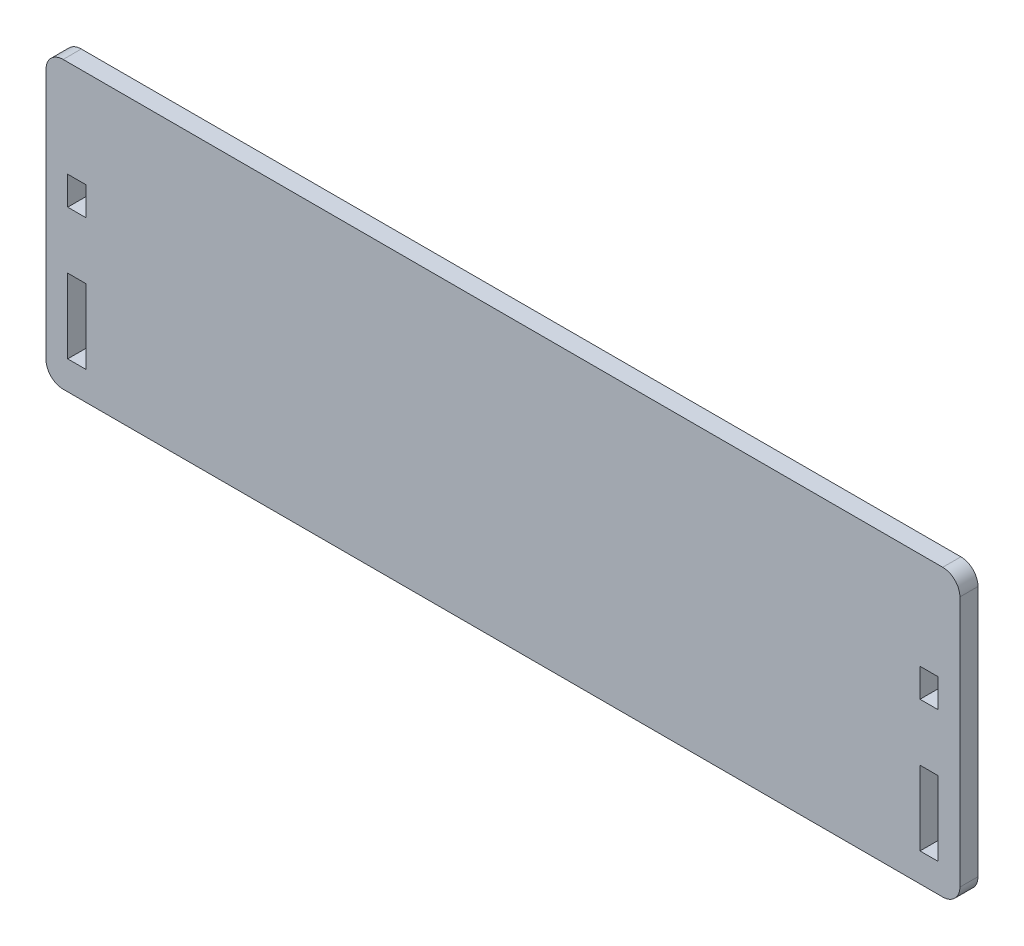
ISO-10303-21;
HEADER;
FILE_DESCRIPTION(('STEP AP214'),'2;1');
FILE_NAME('part.step','',(''),(''),'','','');
FILE_SCHEMA(('AUTOMOTIVE_DESIGN { 1 0 10303 214 1 1 1 1 }'));
ENDSEC;
DATA;
#1=APPLICATION_CONTEXT('core data for automotive mechanical design processes');
#2=APPLICATION_PROTOCOL_DEFINITION('international standard','automotive_design',2000,#1);
#3=PRODUCT_CONTEXT('',#1,'mechanical');
#4=PRODUCT('Part','Part','',(#3));
#5=PRODUCT_RELATED_PRODUCT_CATEGORY('part','',(#4));
#6=PRODUCT_DEFINITION_FORMATION('','',#4);
#7=PRODUCT_DEFINITION_CONTEXT('part definition',#1,'design');
#8=PRODUCT_DEFINITION('design','',#6,#7);
#9=PRODUCT_DEFINITION_SHAPE('','',#8);
#10=(LENGTH_UNIT() NAMED_UNIT(*) SI_UNIT(.MILLI.,.METRE.));
#11=(NAMED_UNIT(*) PLANE_ANGLE_UNIT() SI_UNIT($,.RADIAN.));
#12=(NAMED_UNIT(*) SI_UNIT($,.STERADIAN.) SOLID_ANGLE_UNIT());
#13=UNCERTAINTY_MEASURE_WITH_UNIT(LENGTH_MEASURE(1.E-05),#10,'distance_accuracy_value','');
#14=(GEOMETRIC_REPRESENTATION_CONTEXT(3) GLOBAL_UNCERTAINTY_ASSIGNED_CONTEXT((#13)) GLOBAL_UNIT_ASSIGNED_CONTEXT((#10,
#11,#12)) REPRESENTATION_CONTEXT('',''));
#15=CARTESIAN_POINT('',(0.,0.,0.));
#16=DIRECTION('',(0.,0.,1.));
#17=DIRECTION('',(1.,0.,0.));
#18=AXIS2_PLACEMENT_3D('',#15,#16,#17);
#19=CARTESIAN_POINT('',(-73.025,0.,3.175));
#20=DIRECTION('',(1.,0.,0.));
#21=DIRECTION('',(0.,0.,-1.));
#22=AXIS2_PLACEMENT_3D('',#19,#20,#21);
#23=PLANE('',#22);
#24=DIRECTION('',(0.,-1.,0.));
#25=VECTOR('',#24,1.);
#26=CARTESIAN_POINT('',(-73.025,0.,0.));
#27=LINE('',#26,#25);
#28=CARTESIAN_POINT('',(-73.025,-7.,0.));
#29=VERTEX_POINT('',#28);
#30=CARTESIAN_POINT('',(-73.025,-20.,0.));
#31=VERTEX_POINT('',#30);
#32=EDGE_CURVE('E314',#29,#31,#27,.T.);
#33=ORIENTED_EDGE('',*,*,#32,.T.);
#34=DIRECTION('',(0.,0.,-1.));
#35=VECTOR('',#34,1.);
#36=CARTESIAN_POINT('',(-73.025,-20.,3.175));
#37=LINE('',#36,#35);
#38=CARTESIAN_POINT('',(-73.025,-20.,3.175));
#39=VERTEX_POINT('',#38);
#40=EDGE_CURVE('E332',#39,#31,#37,.T.);
#41=ORIENTED_EDGE('',*,*,#40,.F.);
#42=DIRECTION('',(0.,-1.,0.));
#43=VECTOR('',#42,1.);
#44=CARTESIAN_POINT('',(-73.025,0.,3.175));
#45=LINE('',#44,#43);
#46=CARTESIAN_POINT('',(-73.025,-7.,3.175));
#47=VERTEX_POINT('',#46);
#48=EDGE_CURVE('E260',#47,#39,#45,.T.);
#49=ORIENTED_EDGE('',*,*,#48,.F.);
#50=DIRECTION('',(0.,0.,-1.));
#51=VECTOR('',#50,1.);
#52=CARTESIAN_POINT('',(-73.025,-7.,3.175));
#53=LINE('',#52,#51);
#54=EDGE_CURVE('E322',#47,#29,#53,.T.);
#55=ORIENTED_EDGE('',*,*,#54,.T.);
#56=EDGE_LOOP('',(#33,#41,#49,#55));
#57=FACE_BOUND('',#56,.T.);
#58=ADVANCED_FACE('F36',(#57),#23,.F.);
#59=CARTESIAN_POINT('',(0.,-20.,3.175));
#60=DIRECTION('',(0.,-1.,0.));
#61=DIRECTION('',(0.,0.,-1.));
#62=AXIS2_PLACEMENT_3D('',#59,#60,#61);
#63=PLANE('',#62);
#64=DIRECTION('',(-1.,0.,0.));
#65=VECTOR('',#64,1.);
#66=CARTESIAN_POINT('',(0.,-20.,0.));
#67=LINE('',#66,#65);
#68=CARTESIAN_POINT('',(-76.2,-20.,0.));
#69=VERTEX_POINT('',#68);
#70=EDGE_CURVE('E317',#31,#69,#67,.T.);
#71=ORIENTED_EDGE('',*,*,#70,.T.);
#72=DIRECTION('',(0.,0.,-1.));
#73=VECTOR('',#72,1.);
#74=CARTESIAN_POINT('',(-76.2,-20.,3.175));
#75=LINE('',#74,#73);
#76=CARTESIAN_POINT('',(-76.2,-20.,3.175));
#77=VERTEX_POINT('',#76);
#78=EDGE_CURVE('E329',#77,#69,#75,.T.);
#79=ORIENTED_EDGE('',*,*,#78,.F.);
#80=DIRECTION('',(-1.,0.,0.));
#81=VECTOR('',#80,1.);
#82=CARTESIAN_POINT('',(0.,-20.,3.175));
#83=LINE('',#82,#81);
#84=EDGE_CURVE('E263',#39,#77,#83,.T.);
#85=ORIENTED_EDGE('',*,*,#84,.F.);
#86=ORIENTED_EDGE('',*,*,#40,.T.);
#87=EDGE_LOOP('',(#71,#79,#85,#86));
#88=FACE_BOUND('',#87,.T.);
#89=ADVANCED_FACE('F424',(#88),#63,.F.);
#90=CARTESIAN_POINT('',(-76.2,0.,3.175));
#91=DIRECTION('',(-1.,0.,0.));
#92=DIRECTION('',(0.,0.,1.));
#93=AXIS2_PLACEMENT_3D('',#90,#91,#92);
#94=PLANE('',#93);
#95=DIRECTION('',(0.,1.,0.));
#96=VECTOR('',#95,1.);
#97=CARTESIAN_POINT('',(-76.2,0.,0.));
#98=LINE('',#97,#96);
#99=CARTESIAN_POINT('',(-76.2,-7.,0.));
#100=VERTEX_POINT('',#99);
#101=EDGE_CURVE('E319',#69,#100,#98,.T.);
#102=ORIENTED_EDGE('',*,*,#101,.T.);
#103=DIRECTION('',(0.,0.,-1.));
#104=VECTOR('',#103,1.);
#105=CARTESIAN_POINT('',(-76.2,-7.,3.175));
#106=LINE('',#105,#104);
#107=CARTESIAN_POINT('',(-76.2,-7.,3.175));
#108=VERTEX_POINT('',#107);
#109=EDGE_CURVE('E325',#108,#100,#106,.T.);
#110=ORIENTED_EDGE('',*,*,#109,.F.);
#111=DIRECTION('',(0.,1.,0.));
#112=VECTOR('',#111,1.);
#113=CARTESIAN_POINT('',(-76.2,0.,3.175));
#114=LINE('',#113,#112);
#115=EDGE_CURVE('E265',#77,#108,#114,.T.);
#116=ORIENTED_EDGE('',*,*,#115,.F.);
#117=ORIENTED_EDGE('',*,*,#78,.T.);
#118=EDGE_LOOP('',(#102,#110,#116,#117));
#119=FACE_BOUND('',#118,.T.);
#120=ADVANCED_FACE('F430',(#119),#94,.F.);
#121=CARTESIAN_POINT('',(-73.025,0.,3.175));
#122=DIRECTION('',(1.,0.,0.));
#123=DIRECTION('',(0.,0.,-1.));
#124=AXIS2_PLACEMENT_3D('',#121,#122,#123);
#125=PLANE('',#124);
#126=DIRECTION('',(0.,-1.,0.));
#127=VECTOR('',#126,1.);
#128=CARTESIAN_POINT('',(-73.025,0.,0.));
#129=LINE('',#128,#127);
#130=CARTESIAN_POINT('',(-73.025,8.,0.));
#131=VERTEX_POINT('',#130);
#132=CARTESIAN_POINT('',(-73.025,3.,0.));
#133=VERTEX_POINT('',#132);
#134=EDGE_CURVE('E303',#131,#133,#129,.T.);
#135=ORIENTED_EDGE('',*,*,#134,.T.);
#136=DIRECTION('',(0.,0.,-1.));
#137=VECTOR('',#136,1.);
#138=CARTESIAN_POINT('',(-73.025,3.,3.175));
#139=LINE('',#138,#137);
#140=CARTESIAN_POINT('',(-73.025,3.,3.175));
#141=VERTEX_POINT('',#140);
#142=EDGE_CURVE('E326',#141,#133,#139,.T.);
#143=ORIENTED_EDGE('',*,*,#142,.F.);
#144=DIRECTION('',(0.,-1.,0.));
#145=VECTOR('',#144,1.);
#146=CARTESIAN_POINT('',(-73.025,0.,3.175));
#147=LINE('',#146,#145);
#148=CARTESIAN_POINT('',(-73.025,8.,3.175));
#149=VERTEX_POINT('',#148);
#150=EDGE_CURVE('E250',#149,#141,#147,.T.);
#151=ORIENTED_EDGE('',*,*,#150,.F.);
#152=DIRECTION('',(0.,0.,-1.));
#153=VECTOR('',#152,1.);
#154=CARTESIAN_POINT('',(-73.025,8.,3.175));
#155=LINE('',#154,#153);
#156=EDGE_CURVE('E336',#149,#131,#155,.T.);
#157=ORIENTED_EDGE('',*,*,#156,.T.);
#158=EDGE_LOOP('',(#135,#143,#151,#157));
#159=FACE_BOUND('',#158,.T.);
#160=ADVANCED_FACE('F447',(#159),#125,.F.);
#161=CARTESIAN_POINT('',(0.,3.,3.175));
#162=DIRECTION('',(0.,-1.,0.));
#163=DIRECTION('',(0.,0.,-1.));
#164=AXIS2_PLACEMENT_3D('',#161,#162,#163);
#165=PLANE('',#164);
#166=DIRECTION('',(-1.,0.,0.));
#167=VECTOR('',#166,1.);
#168=CARTESIAN_POINT('',(0.,3.,0.));
#169=LINE('',#168,#167);
#170=CARTESIAN_POINT('',(-76.2,3.,0.));
#171=VERTEX_POINT('',#170);
#172=EDGE_CURVE('E306',#133,#171,#169,.T.);
#173=ORIENTED_EDGE('',*,*,#172,.T.);
#174=DIRECTION('',(0.,0.,-1.));
#175=VECTOR('',#174,1.);
#176=CARTESIAN_POINT('',(-76.2,3.,3.175));
#177=LINE('',#176,#175);
#178=CARTESIAN_POINT('',(-76.2,3.,3.175));
#179=VERTEX_POINT('',#178);
#180=EDGE_CURVE('E342',#179,#171,#177,.T.);
#181=ORIENTED_EDGE('',*,*,#180,.F.);
#182=DIRECTION('',(-1.,0.,0.));
#183=VECTOR('',#182,1.);
#184=CARTESIAN_POINT('',(0.,3.,3.175));
#185=LINE('',#184,#183);
#186=EDGE_CURVE('E253',#141,#179,#185,.T.);
#187=ORIENTED_EDGE('',*,*,#186,.F.);
#188=ORIENTED_EDGE('',*,*,#142,.T.);
#189=EDGE_LOOP('',(#173,#181,#187,#188));
#190=FACE_BOUND('',#189,.T.);
#191=ADVANCED_FACE('F443',(#190),#165,.F.);
#192=CARTESIAN_POINT('',(-76.2,0.,3.175));
#193=DIRECTION('',(1.,0.,0.));
#194=DIRECTION('',(0.,0.,-1.));
#195=AXIS2_PLACEMENT_3D('',#192,#193,#194);
#196=PLANE('',#195);
#197=DIRECTION('',(0.,-1.,0.));
#198=VECTOR('',#197,1.);
#199=CARTESIAN_POINT('',(-76.2,0.,0.));
#200=LINE('',#199,#198);
#201=CARTESIAN_POINT('',(-76.2,8.,0.));
#202=VERTEX_POINT('',#201);
#203=EDGE_CURVE('E309',#202,#171,#200,.T.);
#204=ORIENTED_EDGE('',*,*,#203,.F.);
#205=DIRECTION('',(0.,0.,-1.));
#206=VECTOR('',#205,1.);
#207=CARTESIAN_POINT('',(-76.2,8.,3.175));
#208=LINE('',#207,#206);
#209=CARTESIAN_POINT('',(-76.2,8.,3.175));
#210=VERTEX_POINT('',#209);
#211=EDGE_CURVE('E339',#210,#202,#208,.T.);
#212=ORIENTED_EDGE('',*,*,#211,.F.);
#213=DIRECTION('',(0.,-1.,0.));
#214=VECTOR('',#213,1.);
#215=CARTESIAN_POINT('',(-76.2,0.,3.175));
#216=LINE('',#215,#214);
#217=EDGE_CURVE('E255',#210,#179,#216,.T.);
#218=ORIENTED_EDGE('',*,*,#217,.T.);
#219=ORIENTED_EDGE('',*,*,#180,.T.);
#220=EDGE_LOOP('',(#204,#212,#218,#219));
#221=FACE_BOUND('',#220,.T.);
#222=ADVANCED_FACE('F440',(#221),#196,.T.);
#223=CARTESIAN_POINT('',(80.,0.,3.175));
#224=DIRECTION('',(1.,0.,0.));
#225=DIRECTION('',(0.,0.,-1.));
#226=AXIS2_PLACEMENT_3D('',#223,#224,#225);
#227=PLANE('',#226);
#228=DIRECTION('',(0.,-1.,0.));
#229=VECTOR('',#228,1.);
#230=CARTESIAN_POINT('',(80.,0.,3.175));
#231=LINE('',#230,#229);
#232=CARTESIAN_POINT('',(80.,22.,3.175));
#233=VERTEX_POINT('',#232);
#234=CARTESIAN_POINT('',(80.,-22.,3.175));
#235=VERTEX_POINT('',#234);
#236=EDGE_CURVE('E240',#233,#235,#231,.T.);
#237=ORIENTED_EDGE('',*,*,#236,.T.);
#238=DIRECTION('',(0.,0.,-1.));
#239=VECTOR('',#238,1.);
#240=CARTESIAN_POINT('',(80.,-22.,0.));
#241=LINE('',#240,#239);
#242=CARTESIAN_POINT('',(80.,-22.,0.));
#243=VERTEX_POINT('',#242);
#244=EDGE_CURVE('E44',#235,#243,#241,.T.);
#245=ORIENTED_EDGE('',*,*,#244,.T.);
#246=DIRECTION('',(0.,-1.,0.));
#247=VECTOR('',#246,1.);
#248=CARTESIAN_POINT('',(80.,0.,0.));
#249=LINE('',#248,#247);
#250=CARTESIAN_POINT('',(80.,22.,0.));
#251=VERTEX_POINT('',#250);
#252=EDGE_CURVE('E291',#251,#243,#249,.T.);
#253=ORIENTED_EDGE('',*,*,#252,.F.);
#254=DIRECTION('',(0.,0.,-1.));
#255=VECTOR('',#254,1.);
#256=CARTESIAN_POINT('',(80.,22.,3.175));
#257=LINE('',#256,#255);
#258=EDGE_CURVE('E58',#251,#233,#257,.F.);
#259=ORIENTED_EDGE('',*,*,#258,.T.);
#260=EDGE_LOOP('',(#237,#245,#253,#259));
#261=FACE_BOUND('',#260,.T.);
#262=ADVANCED_FACE('F384',(#261),#227,.T.);
#263=CARTESIAN_POINT('',(0.,25.,3.175));
#264=DIRECTION('',(0.,1.,0.));
#265=DIRECTION('',(0.,0.,1.));
#266=AXIS2_PLACEMENT_3D('',#263,#264,#265);
#267=PLANE('',#266);
#268=DIRECTION('',(1.,0.,0.));
#269=VECTOR('',#268,1.);
#270=CARTESIAN_POINT('',(0.,25.,3.175));
#271=LINE('',#270,#269);
#272=CARTESIAN_POINT('',(-77.,25.,3.175));
#273=VERTEX_POINT('',#272);
#274=CARTESIAN_POINT('',(77.,25.,3.175));
#275=VERTEX_POINT('',#274);
#276=EDGE_CURVE('E242',#273,#275,#271,.T.);
#277=ORIENTED_EDGE('',*,*,#276,.T.);
#278=DIRECTION('',(0.,0.,-1.));
#279=VECTOR('',#278,1.);
#280=CARTESIAN_POINT('',(77.,25.,3.175));
#281=LINE('',#280,#279);
#282=CARTESIAN_POINT('',(77.,25.,0.));
#283=VERTEX_POINT('',#282);
#284=EDGE_CURVE('E11',#275,#283,#281,.T.);
#285=ORIENTED_EDGE('',*,*,#284,.T.);
#286=DIRECTION('',(1.,0.,0.));
#287=VECTOR('',#286,1.);
#288=CARTESIAN_POINT('',(0.,25.,0.));
#289=LINE('',#288,#287);
#290=CARTESIAN_POINT('',(-77.,25.,0.));
#291=VERTEX_POINT('',#290);
#292=EDGE_CURVE('E294',#291,#283,#289,.T.);
#293=ORIENTED_EDGE('',*,*,#292,.F.);
#294=DIRECTION('',(0.,0.,-1.));
#295=VECTOR('',#294,1.);
#296=CARTESIAN_POINT('',(-77.,25.,3.175));
#297=LINE('',#296,#295);
#298=EDGE_CURVE('E360',#291,#273,#297,.F.);
#299=ORIENTED_EDGE('',*,*,#298,.T.);
#300=EDGE_LOOP('',(#277,#285,#293,#299));
#301=FACE_BOUND('',#300,.T.);
#302=ADVANCED_FACE('F395',(#301),#267,.T.);
#303=CARTESIAN_POINT('',(-80.,0.,3.175));
#304=DIRECTION('',(1.,0.,0.));
#305=DIRECTION('',(0.,0.,-1.));
#306=AXIS2_PLACEMENT_3D('',#303,#304,#305);
#307=PLANE('',#306);
#308=DIRECTION('',(0.,-1.,0.));
#309=VECTOR('',#308,1.);
#310=CARTESIAN_POINT('',(-80.,0.,0.));
#311=LINE('',#310,#309);
#312=CARTESIAN_POINT('',(-80.,22.,0.));
#313=VERTEX_POINT('',#312);
#314=CARTESIAN_POINT('',(-80.,-22.,0.));
#315=VERTEX_POINT('',#314);
#316=EDGE_CURVE('E297',#313,#315,#311,.T.);
#317=ORIENTED_EDGE('',*,*,#316,.T.);
#318=DIRECTION('',(0.,0.,-1.));
#319=VECTOR('',#318,1.);
#320=CARTESIAN_POINT('',(-80.,-22.,3.175));
#321=LINE('',#320,#319);
#322=CARTESIAN_POINT('',(-80.,-22.,3.175));
#323=VERTEX_POINT('',#322);
#324=EDGE_CURVE('E375',#315,#323,#321,.F.);
#325=ORIENTED_EDGE('',*,*,#324,.T.);
#326=DIRECTION('',(0.,-1.,0.));
#327=VECTOR('',#326,1.);
#328=CARTESIAN_POINT('',(-80.,0.,3.175));
#329=LINE('',#328,#327);
#330=CARTESIAN_POINT('',(-80.,22.,3.175));
#331=VERTEX_POINT('',#330);
#332=EDGE_CURVE('E245',#331,#323,#329,.T.);
#333=ORIENTED_EDGE('',*,*,#332,.F.);
#334=DIRECTION('',(0.,0.,-1.));
#335=VECTOR('',#334,1.);
#336=CARTESIAN_POINT('',(-80.,22.,0.));
#337=LINE('',#336,#335);
#338=EDGE_CURVE('E335',#331,#313,#337,.T.);
#339=ORIENTED_EDGE('',*,*,#338,.T.);
#340=EDGE_LOOP('',(#317,#325,#333,#339));
#341=FACE_BOUND('',#340,.T.);
#342=ADVANCED_FACE('F406',(#341),#307,.F.);
#343=CARTESIAN_POINT('',(0.,-6.99999999999999,3.175));
#344=DIRECTION('',(0.,-1.,0.));
#345=DIRECTION('',(0.,0.,-1.));
#346=AXIS2_PLACEMENT_3D('',#343,#344,#345);
#347=PLANE('',#346);
#348=DIRECTION('',(-1.,0.,0.));
#349=VECTOR('',#348,1.);
#350=CARTESIAN_POINT('',(0.,-6.99999999999999,0.));
#351=LINE('',#350,#349);
#352=CARTESIAN_POINT('',(76.2,-6.99999999999999,0.));
#353=VERTEX_POINT('',#352);
#354=CARTESIAN_POINT('',(73.025,-6.99999999999999,0.));
#355=VERTEX_POINT('',#354);
#356=EDGE_CURVE('E279',#353,#355,#351,.T.);
#357=ORIENTED_EDGE('',*,*,#356,.F.);
#358=DIRECTION('',(0.,0.,-1.));
#359=VECTOR('',#358,1.);
#360=CARTESIAN_POINT('',(76.2,-6.99999999999999,3.175));
#361=LINE('',#360,#359);
#362=CARTESIAN_POINT('',(76.2,-6.99999999999999,3.175));
#363=VERTEX_POINT('',#362);
#364=EDGE_CURVE('E340',#363,#353,#361,.T.);
#365=ORIENTED_EDGE('',*,*,#364,.F.);
#366=DIRECTION('',(-1.,0.,0.));
#367=VECTOR('',#366,1.);
#368=CARTESIAN_POINT('',(0.,-6.99999999999999,3.175));
#369=LINE('',#368,#367);
#370=CARTESIAN_POINT('',(73.025,-6.99999999999999,3.175));
#371=VERTEX_POINT('',#370);
#372=EDGE_CURVE('E229',#363,#371,#369,.T.);
#373=ORIENTED_EDGE('',*,*,#372,.T.);
#374=DIRECTION('',(0.,0.,-1.));
#375=VECTOR('',#374,1.);
#376=CARTESIAN_POINT('',(73.025,-6.99999999999999,3.175));
#377=LINE('',#376,#375);
#378=EDGE_CURVE('E210',#371,#355,#377,.T.);
#379=ORIENTED_EDGE('',*,*,#378,.T.);
#380=EDGE_LOOP('',(#357,#365,#373,#379));
#381=FACE_BOUND('',#380,.T.);
#382=ADVANCED_FACE('F457',(#381),#347,.T.);
#383=CARTESIAN_POINT('',(76.2,0.,3.175));
#384=DIRECTION('',(1.,0.,0.));
#385=DIRECTION('',(0.,0.,-1.));
#386=AXIS2_PLACEMENT_3D('',#383,#384,#385);
#387=PLANE('',#386);
#388=DIRECTION('',(0.,-1.,0.));
#389=VECTOR('',#388,1.);
#390=CARTESIAN_POINT('',(76.2,0.,0.));
#391=LINE('',#390,#389);
#392=CARTESIAN_POINT('',(76.2,-20.,0.));
#393=VERTEX_POINT('',#392);
#394=EDGE_CURVE('E282',#353,#393,#391,.T.);
#395=ORIENTED_EDGE('',*,*,#394,.T.);
#396=DIRECTION('',(0.,0.,-1.));
#397=VECTOR('',#396,1.);
#398=CARTESIAN_POINT('',(76.2,-20.,3.175));
#399=LINE('',#398,#397);
#400=CARTESIAN_POINT('',(76.2,-20.,3.175));
#401=VERTEX_POINT('',#400);
#402=EDGE_CURVE('E349',#401,#393,#399,.T.);
#403=ORIENTED_EDGE('',*,*,#402,.F.);
#404=DIRECTION('',(0.,-1.,0.));
#405=VECTOR('',#404,1.);
#406=CARTESIAN_POINT('',(76.2,0.,3.175));
#407=LINE('',#406,#405);
#408=EDGE_CURVE('E232',#363,#401,#407,.T.);
#409=ORIENTED_EDGE('',*,*,#408,.F.);
#410=ORIENTED_EDGE('',*,*,#364,.T.);
#411=EDGE_LOOP('',(#395,#403,#409,#410));
#412=FACE_BOUND('',#411,.T.);
#413=ADVANCED_FACE('F469',(#412),#387,.F.);
#414=CARTESIAN_POINT('',(0.,-20.,3.175));
#415=DIRECTION('',(0.,1.,0.));
#416=DIRECTION('',(0.,0.,1.));
#417=AXIS2_PLACEMENT_3D('',#414,#415,#416);
#418=PLANE('',#417);
#419=DIRECTION('',(1.,0.,0.));
#420=VECTOR('',#419,1.);
#421=CARTESIAN_POINT('',(0.,-20.,0.));
#422=LINE('',#421,#420);
#423=CARTESIAN_POINT('',(73.025,-20.,0.));
#424=VERTEX_POINT('',#423);
#425=EDGE_CURVE('E285',#424,#393,#422,.T.);
#426=ORIENTED_EDGE('',*,*,#425,.F.);
#427=DIRECTION('',(0.,0.,-1.));
#428=VECTOR('',#427,1.);
#429=CARTESIAN_POINT('',(73.025,-20.,3.175));
#430=LINE('',#429,#428);
#431=CARTESIAN_POINT('',(73.025,-20.,3.175));
#432=VERTEX_POINT('',#431);
#433=EDGE_CURVE('E347',#432,#424,#430,.T.);
#434=ORIENTED_EDGE('',*,*,#433,.F.);
#435=DIRECTION('',(1.,0.,0.));
#436=VECTOR('',#435,1.);
#437=CARTESIAN_POINT('',(0.,-20.,3.175));
#438=LINE('',#437,#436);
#439=EDGE_CURVE('E234',#432,#401,#438,.T.);
#440=ORIENTED_EDGE('',*,*,#439,.T.);
#441=ORIENTED_EDGE('',*,*,#402,.T.);
#442=EDGE_LOOP('',(#426,#434,#440,#441));
#443=FACE_BOUND('',#442,.T.);
#444=ADVANCED_FACE('F466',(#443),#418,.T.);
#445=CARTESIAN_POINT('',(73.025,0.,3.175));
#446=DIRECTION('',(1.,0.,0.));
#447=DIRECTION('',(0.,0.,-1.));
#448=AXIS2_PLACEMENT_3D('',#445,#446,#447);
#449=PLANE('',#448);
#450=DIRECTION('',(0.,-1.,0.));
#451=VECTOR('',#450,1.);
#452=CARTESIAN_POINT('',(73.025,0.,0.));
#453=LINE('',#452,#451);
#454=CARTESIAN_POINT('',(73.025,8.,0.));
#455=VERTEX_POINT('',#454);
#456=CARTESIAN_POINT('',(73.025,3.,0.));
#457=VERTEX_POINT('',#456);
#458=EDGE_CURVE('E205',#455,#457,#453,.T.);
#459=ORIENTED_EDGE('',*,*,#458,.F.);
#460=DIRECTION('',(0.,0.,-1.));
#461=VECTOR('',#460,1.);
#462=CARTESIAN_POINT('',(73.025,8.,3.175));
#463=LINE('',#462,#461);
#464=CARTESIAN_POINT('',(73.025,8.,3.175));
#465=VERTEX_POINT('',#464);
#466=EDGE_CURVE('E199',#465,#455,#463,.T.);
#467=ORIENTED_EDGE('',*,*,#466,.F.);
#468=DIRECTION('',(0.,-1.,0.));
#469=VECTOR('',#468,1.);
#470=CARTESIAN_POINT('',(73.025,0.,3.175));
#471=LINE('',#470,#469);
#472=CARTESIAN_POINT('',(73.025,3.,3.175));
#473=VERTEX_POINT('',#472);
#474=EDGE_CURVE('E202',#465,#473,#471,.T.);
#475=ORIENTED_EDGE('',*,*,#474,.T.);
#476=DIRECTION('',(0.,0.,-1.));
#477=VECTOR('',#476,1.);
#478=CARTESIAN_POINT('',(73.025,3.,3.175));
#479=LINE('',#478,#477);
#480=EDGE_CURVE('E269',#473,#457,#479,.T.);
#481=ORIENTED_EDGE('',*,*,#480,.T.);
#482=EDGE_LOOP('',(#459,#467,#475,#481));
#483=FACE_BOUND('',#482,.T.);
#484=ADVANCED_FACE('F201',(#483),#449,.T.);
#485=CARTESIAN_POINT('',(0.,8.,3.175));
#486=DIRECTION('',(0.,-1.,0.));
#487=DIRECTION('',(0.,0.,-1.));
#488=AXIS2_PLACEMENT_3D('',#485,#486,#487);
#489=PLANE('',#488);
#490=DIRECTION('',(-1.,0.,0.));
#491=VECTOR('',#490,1.);
#492=CARTESIAN_POINT('',(0.,8.,0.));
#493=LINE('',#492,#491);
#494=CARTESIAN_POINT('',(76.2,8.,0.));
#495=VERTEX_POINT('',#494);
#496=EDGE_CURVE('E271',#495,#455,#493,.T.);
#497=ORIENTED_EDGE('',*,*,#496,.F.);
#498=DIRECTION('',(0.,0.,-1.));
#499=VECTOR('',#498,1.);
#500=CARTESIAN_POINT('',(76.2,8.,3.175));
#501=LINE('',#500,#499);
#502=CARTESIAN_POINT('',(76.2,8.,3.175));
#503=VERTEX_POINT('',#502);
#504=EDGE_CURVE('E211',#503,#495,#501,.T.);
#505=ORIENTED_EDGE('',*,*,#504,.F.);
#506=DIRECTION('',(-1.,0.,0.));
#507=VECTOR('',#506,1.);
#508=CARTESIAN_POINT('',(0.,8.,3.175));
#509=LINE('',#508,#507);
#510=EDGE_CURVE('E217',#503,#465,#509,.T.);
#511=ORIENTED_EDGE('',*,*,#510,.T.);
#512=ORIENTED_EDGE('',*,*,#466,.T.);
#513=EDGE_LOOP('',(#497,#505,#511,#512));
#514=FACE_BOUND('',#513,.T.);
#515=ADVANCED_FACE('F222',(#514),#489,.T.);
#516=CARTESIAN_POINT('',(76.2,0.,3.175));
#517=DIRECTION('',(1.,0.,0.));
#518=DIRECTION('',(0.,0.,-1.));
#519=AXIS2_PLACEMENT_3D('',#516,#517,#518);
#520=PLANE('',#519);
#521=DIRECTION('',(0.,-1.,0.));
#522=VECTOR('',#521,1.);
#523=CARTESIAN_POINT('',(76.2,0.,0.));
#524=LINE('',#523,#522);
#525=CARTESIAN_POINT('',(76.2,3.,0.));
#526=VERTEX_POINT('',#525);
#527=EDGE_CURVE('E273',#495,#526,#524,.T.);
#528=ORIENTED_EDGE('',*,*,#527,.T.);
#529=DIRECTION('',(0.,0.,-1.));
#530=VECTOR('',#529,1.);
#531=CARTESIAN_POINT('',(76.2,3.,3.175));
#532=LINE('',#531,#530);
#533=CARTESIAN_POINT('',(76.2,3.,3.175));
#534=VERTEX_POINT('',#533);
#535=EDGE_CURVE('E353',#534,#526,#532,.T.);
#536=ORIENTED_EDGE('',*,*,#535,.F.);
#537=DIRECTION('',(0.,-1.,0.));
#538=VECTOR('',#537,1.);
#539=CARTESIAN_POINT('',(76.2,0.,3.175));
#540=LINE('',#539,#538);
#541=EDGE_CURVE('E224',#503,#534,#540,.T.);
#542=ORIENTED_EDGE('',*,*,#541,.F.);
#543=ORIENTED_EDGE('',*,*,#504,.T.);
#544=EDGE_LOOP('',(#528,#536,#542,#543));
#545=FACE_BOUND('',#544,.T.);
#546=ADVANCED_FACE('F438',(#545),#520,.F.);
#547=CARTESIAN_POINT('',(0.,8.,3.175));
#548=DIRECTION('',(0.,1.,0.));
#549=DIRECTION('',(0.,0.,1.));
#550=AXIS2_PLACEMENT_3D('',#547,#548,#549);
#551=PLANE('',#550);
#552=DIRECTION('',(1.,0.,0.));
#553=VECTOR('',#552,1.);
#554=CARTESIAN_POINT('',(0.,8.,0.));
#555=LINE('',#554,#553);
#556=EDGE_CURVE('E312',#202,#131,#555,.T.);
#557=ORIENTED_EDGE('',*,*,#556,.T.);
#558=ORIENTED_EDGE('',*,*,#156,.F.);
#559=DIRECTION('',(1.,0.,0.));
#560=VECTOR('',#559,1.);
#561=CARTESIAN_POINT('',(0.,8.,3.175));
#562=LINE('',#561,#560);
#563=EDGE_CURVE('E258',#210,#149,#562,.T.);
#564=ORIENTED_EDGE('',*,*,#563,.F.);
#565=ORIENTED_EDGE('',*,*,#211,.T.);
#566=EDGE_LOOP('',(#557,#558,#564,#565));
#567=FACE_BOUND('',#566,.T.);
#568=ADVANCED_FACE('F435',(#567),#551,.F.);
#569=CARTESIAN_POINT('',(0.,-25.,3.175));
#570=DIRECTION('',(0.,1.,0.));
#571=DIRECTION('',(0.,0.,1.));
#572=AXIS2_PLACEMENT_3D('',#569,#570,#571);
#573=PLANE('',#572);
#574=DIRECTION('',(1.,0.,0.));
#575=VECTOR('',#574,1.);
#576=CARTESIAN_POINT('',(0.,-25.,3.175));
#577=LINE('',#576,#575);
#578=CARTESIAN_POINT('',(-77.,-25.,3.175));
#579=VERTEX_POINT('',#578);
#580=CARTESIAN_POINT('',(77.,-25.,3.175));
#581=VERTEX_POINT('',#580);
#582=EDGE_CURVE('E248',#579,#581,#577,.T.);
#583=ORIENTED_EDGE('',*,*,#582,.F.);
#584=DIRECTION('',(0.,0.,-1.));
#585=VECTOR('',#584,1.);
#586=CARTESIAN_POINT('',(-77.,-25.,3.175));
#587=LINE('',#586,#585);
#588=CARTESIAN_POINT('',(-77.,-25.,0.));
#589=VERTEX_POINT('',#588);
#590=EDGE_CURVE('E366',#579,#589,#587,.T.);
#591=ORIENTED_EDGE('',*,*,#590,.T.);
#592=DIRECTION('',(1.,0.,0.));
#593=VECTOR('',#592,1.);
#594=CARTESIAN_POINT('',(0.,-25.,0.));
#595=LINE('',#594,#593);
#596=CARTESIAN_POINT('',(77.,-25.,0.));
#597=VERTEX_POINT('',#596);
#598=EDGE_CURVE('E300',#589,#597,#595,.T.);
#599=ORIENTED_EDGE('',*,*,#598,.T.);
#600=DIRECTION('',(0.,0.,-1.));
#601=VECTOR('',#600,1.);
#602=CARTESIAN_POINT('',(77.,-25.,3.175));
#603=LINE('',#602,#601);
#604=EDGE_CURVE('E364',#597,#581,#603,.F.);
#605=ORIENTED_EDGE('',*,*,#604,.T.);
#606=EDGE_LOOP('',(#583,#591,#599,#605));
#607=FACE_BOUND('',#606,.T.);
#608=ADVANCED_FACE('F414',(#607),#573,.F.);
#609=CARTESIAN_POINT('',(73.025,0.,3.175));
#610=DIRECTION('',(1.,0.,0.));
#611=DIRECTION('',(0.,0.,-1.));
#612=AXIS2_PLACEMENT_3D('',#609,#610,#611);
#613=PLANE('',#612);
#614=DIRECTION('',(0.,-1.,0.));
#615=VECTOR('',#614,1.);
#616=CARTESIAN_POINT('',(73.025,0.,0.));
#617=LINE('',#616,#615);
#618=EDGE_CURVE('E288',#355,#424,#617,.T.);
#619=ORIENTED_EDGE('',*,*,#618,.F.);
#620=ORIENTED_EDGE('',*,*,#378,.F.);
#621=DIRECTION('',(0.,-1.,0.));
#622=VECTOR('',#621,1.);
#623=CARTESIAN_POINT('',(73.025,0.,3.175));
#624=LINE('',#623,#622);
#625=EDGE_CURVE('E237',#371,#432,#624,.T.);
#626=ORIENTED_EDGE('',*,*,#625,.T.);
#627=ORIENTED_EDGE('',*,*,#433,.T.);
#628=EDGE_LOOP('',(#619,#620,#626,#627));
#629=FACE_BOUND('',#628,.T.);
#630=ADVANCED_FACE('F454',(#629),#613,.T.);
#631=CARTESIAN_POINT('',(0.,3.,3.175));
#632=DIRECTION('',(0.,1.,0.));
#633=DIRECTION('',(0.,0.,1.));
#634=AXIS2_PLACEMENT_3D('',#631,#632,#633);
#635=PLANE('',#634);
#636=DIRECTION('',(1.,0.,0.));
#637=VECTOR('',#636,1.);
#638=CARTESIAN_POINT('',(0.,3.,0.));
#639=LINE('',#638,#637);
#640=EDGE_CURVE('E276',#457,#526,#639,.T.);
#641=ORIENTED_EDGE('',*,*,#640,.F.);
#642=ORIENTED_EDGE('',*,*,#480,.F.);
#643=DIRECTION('',(1.,0.,0.));
#644=VECTOR('',#643,1.);
#645=CARTESIAN_POINT('',(0.,3.,3.175));
#646=LINE('',#645,#644);
#647=EDGE_CURVE('E219',#473,#534,#646,.T.);
#648=ORIENTED_EDGE('',*,*,#647,.T.);
#649=ORIENTED_EDGE('',*,*,#535,.T.);
#650=EDGE_LOOP('',(#641,#642,#648,#649));
#651=FACE_BOUND('',#650,.T.);
#652=ADVANCED_FACE('F464',(#651),#635,.T.);
#653=CARTESIAN_POINT('',(0.,-7.,3.175));
#654=DIRECTION('',(0.,1.,0.));
#655=DIRECTION('',(0.,0.,1.));
#656=AXIS2_PLACEMENT_3D('',#653,#654,#655);
#657=PLANE('',#656);
#658=DIRECTION('',(1.,0.,0.));
#659=VECTOR('',#658,1.);
#660=CARTESIAN_POINT('',(0.,-7.,0.));
#661=LINE('',#660,#659);
#662=EDGE_CURVE('E220',#100,#29,#661,.T.);
#663=ORIENTED_EDGE('',*,*,#662,.T.);
#664=ORIENTED_EDGE('',*,*,#54,.F.);
#665=DIRECTION('',(1.,0.,0.));
#666=VECTOR('',#665,1.);
#667=CARTESIAN_POINT('',(0.,-7.,3.175));
#668=LINE('',#667,#666);
#669=EDGE_CURVE('E267',#108,#47,#668,.T.);
#670=ORIENTED_EDGE('',*,*,#669,.F.);
#671=ORIENTED_EDGE('',*,*,#109,.T.);
#672=EDGE_LOOP('',(#663,#664,#670,#671));
#673=FACE_BOUND('',#672,.T.);
#674=ADVANCED_FACE('F479',(#673),#657,.F.);
#675=CARTESIAN_POINT('',(0.,0.,3.175));
#676=DIRECTION('',(0.,0.,1.));
#677=DIRECTION('',(1.,0.,0.));
#678=AXIS2_PLACEMENT_3D('',#675,#676,#677);
#679=PLANE('',#678);
#680=ORIENTED_EDGE('',*,*,#474,.F.);
#681=ORIENTED_EDGE('',*,*,#510,.F.);
#682=ORIENTED_EDGE('',*,*,#541,.T.);
#683=ORIENTED_EDGE('',*,*,#647,.F.);
#684=EDGE_LOOP('',(#680,#681,#682,#683));
#685=FACE_BOUND('',#684,.T.);
#686=ORIENTED_EDGE('',*,*,#372,.F.);
#687=ORIENTED_EDGE('',*,*,#408,.T.);
#688=ORIENTED_EDGE('',*,*,#439,.F.);
#689=ORIENTED_EDGE('',*,*,#625,.F.);
#690=EDGE_LOOP('',(#686,#687,#688,#689));
#691=FACE_BOUND('',#690,.T.);
#692=ORIENTED_EDGE('',*,*,#332,.T.);
#693=CARTESIAN_POINT('',(-77.,-22.,3.175));
#694=DIRECTION('',(0.,0.,1.));
#695=DIRECTION('',(1.,0.,0.));
#696=AXIS2_PLACEMENT_3D('',#693,#694,#695);
#697=CIRCLE('',#696,3.);
#698=EDGE_CURVE('E380',#323,#579,#697,.T.);
#699=ORIENTED_EDGE('',*,*,#698,.T.);
#700=ORIENTED_EDGE('',*,*,#582,.T.);
#701=CARTESIAN_POINT('',(77.,-22.,3.175));
#702=DIRECTION('',(0.,0.,1.));
#703=DIRECTION('',(1.,0.,0.));
#704=AXIS2_PLACEMENT_3D('',#701,#702,#703);
#705=CIRCLE('',#704,3.);
#706=EDGE_CURVE('E51',#581,#235,#705,.T.);
#707=ORIENTED_EDGE('',*,*,#706,.T.);
#708=ORIENTED_EDGE('',*,*,#236,.F.);
#709=CARTESIAN_POINT('',(77.,22.,3.175));
#710=DIRECTION('',(0.,0.,1.));
#711=DIRECTION('',(1.,0.,0.));
#712=AXIS2_PLACEMENT_3D('',#709,#710,#711);
#713=CIRCLE('',#712,3.);
#714=EDGE_CURVE('E377',#233,#275,#713,.T.);
#715=ORIENTED_EDGE('',*,*,#714,.T.);
#716=ORIENTED_EDGE('',*,*,#276,.F.);
#717=CARTESIAN_POINT('',(-77.,22.,3.175));
#718=DIRECTION('',(0.,0.,1.));
#719=DIRECTION('',(1.,0.,0.));
#720=AXIS2_PLACEMENT_3D('',#717,#718,#719);
#721=CIRCLE('',#720,3.);
#722=EDGE_CURVE('E362',#273,#331,#721,.T.);
#723=ORIENTED_EDGE('',*,*,#722,.T.);
#724=EDGE_LOOP('',(#692,#699,#700,#707,#708,#715,#716,#723));
#725=FACE_BOUND('',#724,.T.);
#726=ORIENTED_EDGE('',*,*,#150,.T.);
#727=ORIENTED_EDGE('',*,*,#186,.T.);
#728=ORIENTED_EDGE('',*,*,#217,.F.);
#729=ORIENTED_EDGE('',*,*,#563,.T.);
#730=EDGE_LOOP('',(#726,#727,#728,#729));
#731=FACE_BOUND('',#730,.T.);
#732=ORIENTED_EDGE('',*,*,#48,.T.);
#733=ORIENTED_EDGE('',*,*,#84,.T.);
#734=ORIENTED_EDGE('',*,*,#115,.T.);
#735=ORIENTED_EDGE('',*,*,#669,.T.);
#736=EDGE_LOOP('',(#732,#733,#734,#735));
#737=FACE_BOUND('',#736,.T.);
#738=ADVANCED_FACE('F215',(#685,#691,#725,#731,#737),#679,.T.);
#739=CARTESIAN_POINT('',(0.,0.,0.));
#740=DIRECTION('',(0.,0.,1.));
#741=DIRECTION('',(1.,0.,0.));
#742=AXIS2_PLACEMENT_3D('',#739,#740,#741);
#743=PLANE('',#742);
#744=ORIENTED_EDGE('',*,*,#458,.T.);
#745=ORIENTED_EDGE('',*,*,#640,.T.);
#746=ORIENTED_EDGE('',*,*,#527,.F.);
#747=ORIENTED_EDGE('',*,*,#496,.T.);
#748=EDGE_LOOP('',(#744,#745,#746,#747));
#749=FACE_BOUND('',#748,.T.);
#750=ORIENTED_EDGE('',*,*,#356,.T.);
#751=ORIENTED_EDGE('',*,*,#618,.T.);
#752=ORIENTED_EDGE('',*,*,#425,.T.);
#753=ORIENTED_EDGE('',*,*,#394,.F.);
#754=EDGE_LOOP('',(#750,#751,#752,#753));
#755=FACE_BOUND('',#754,.T.);
#756=ORIENTED_EDGE('',*,*,#598,.F.);
#757=CARTESIAN_POINT('',(-77.,-22.,0.));
#758=DIRECTION('',(0.,0.,1.));
#759=DIRECTION('',(1.,0.,0.));
#760=AXIS2_PLACEMENT_3D('',#757,#758,#759);
#761=CIRCLE('',#760,3.);
#762=EDGE_CURVE('E373',#589,#315,#761,.F.);
#763=ORIENTED_EDGE('',*,*,#762,.T.);
#764=ORIENTED_EDGE('',*,*,#316,.F.);
#765=CARTESIAN_POINT('',(-77.,22.,0.));
#766=DIRECTION('',(0.,0.,1.));
#767=DIRECTION('',(1.,0.,0.));
#768=AXIS2_PLACEMENT_3D('',#765,#766,#767);
#769=CIRCLE('',#768,3.);
#770=EDGE_CURVE('E358',#313,#291,#769,.F.);
#771=ORIENTED_EDGE('',*,*,#770,.T.);
#772=ORIENTED_EDGE('',*,*,#292,.T.);
#773=CARTESIAN_POINT('',(77.,22.,0.));
#774=DIRECTION('',(0.,0.,1.));
#775=DIRECTION('',(1.,0.,0.));
#776=AXIS2_PLACEMENT_3D('',#773,#774,#775);
#777=CIRCLE('',#776,3.);
#778=EDGE_CURVE('E369',#283,#251,#777,.F.);
#779=ORIENTED_EDGE('',*,*,#778,.T.);
#780=ORIENTED_EDGE('',*,*,#252,.T.);
#781=CARTESIAN_POINT('',(77.,-22.,0.));
#782=DIRECTION('',(0.,0.,1.));
#783=DIRECTION('',(1.,0.,0.));
#784=AXIS2_PLACEMENT_3D('',#781,#782,#783);
#785=CIRCLE('',#784,3.);
#786=EDGE_CURVE('E371',#243,#597,#785,.F.);
#787=ORIENTED_EDGE('',*,*,#786,.T.);
#788=EDGE_LOOP('',(#756,#763,#764,#771,#772,#779,#780,#787));
#789=FACE_BOUND('',#788,.T.);
#790=ORIENTED_EDGE('',*,*,#134,.F.);
#791=ORIENTED_EDGE('',*,*,#556,.F.);
#792=ORIENTED_EDGE('',*,*,#203,.T.);
#793=ORIENTED_EDGE('',*,*,#172,.F.);
#794=EDGE_LOOP('',(#790,#791,#792,#793));
#795=FACE_BOUND('',#794,.T.);
#796=ORIENTED_EDGE('',*,*,#32,.F.);
#797=ORIENTED_EDGE('',*,*,#662,.F.);
#798=ORIENTED_EDGE('',*,*,#101,.F.);
#799=ORIENTED_EDGE('',*,*,#70,.F.);
#800=EDGE_LOOP('',(#796,#797,#798,#799));
#801=FACE_BOUND('',#800,.T.);
#802=ADVANCED_FACE('F388',(#749,#755,#789,#795,#801),#743,.F.);
#803=CARTESIAN_POINT('',(-77.,22.,3.175));
#804=DIRECTION('',(0.,0.,1.));
#805=DIRECTION('',(1.,0.,0.));
#806=AXIS2_PLACEMENT_3D('',#803,#804,#805);
#807=CYLINDRICAL_SURFACE('',#806,3.);
#808=ORIENTED_EDGE('',*,*,#722,.F.);
#809=ORIENTED_EDGE('',*,*,#298,.F.);
#810=ORIENTED_EDGE('',*,*,#770,.F.);
#811=ORIENTED_EDGE('',*,*,#338,.F.);
#812=EDGE_LOOP('',(#808,#809,#810,#811));
#813=FACE_BOUND('',#812,.T.);
#814=ADVANCED_FACE('F403',(#813),#807,.T.);
#815=CARTESIAN_POINT('',(-77.,-22.,3.175));
#816=DIRECTION('',(0.,0.,-1.));
#817=DIRECTION('',(-1.,0.,0.));
#818=AXIS2_PLACEMENT_3D('',#815,#816,#817);
#819=CYLINDRICAL_SURFACE('',#818,3.);
#820=ORIENTED_EDGE('',*,*,#698,.F.);
#821=ORIENTED_EDGE('',*,*,#324,.F.);
#822=ORIENTED_EDGE('',*,*,#762,.F.);
#823=ORIENTED_EDGE('',*,*,#590,.F.);
#824=EDGE_LOOP('',(#820,#821,#822,#823));
#825=FACE_BOUND('',#824,.T.);
#826=ADVANCED_FACE('F411',(#825),#819,.T.);
#827=CARTESIAN_POINT('',(77.,-22.,3.175));
#828=DIRECTION('',(0.,0.,1.));
#829=DIRECTION('',(1.,0.,0.));
#830=AXIS2_PLACEMENT_3D('',#827,#828,#829);
#831=CYLINDRICAL_SURFACE('',#830,3.);
#832=ORIENTED_EDGE('',*,*,#706,.F.);
#833=ORIENTED_EDGE('',*,*,#604,.F.);
#834=ORIENTED_EDGE('',*,*,#786,.F.);
#835=ORIENTED_EDGE('',*,*,#244,.F.);
#836=EDGE_LOOP('',(#832,#833,#834,#835));
#837=FACE_BOUND('',#836,.T.);
#838=ADVANCED_FACE('F416',(#837),#831,.T.);
#839=CARTESIAN_POINT('',(77.,22.,3.175));
#840=DIRECTION('',(0.,0.,-1.));
#841=DIRECTION('',(-1.,0.,0.));
#842=AXIS2_PLACEMENT_3D('',#839,#840,#841);
#843=CYLINDRICAL_SURFACE('',#842,3.);
#844=ORIENTED_EDGE('',*,*,#714,.F.);
#845=ORIENTED_EDGE('',*,*,#258,.F.);
#846=ORIENTED_EDGE('',*,*,#778,.F.);
#847=ORIENTED_EDGE('',*,*,#284,.F.);
#848=EDGE_LOOP('',(#844,#845,#846,#847));
#849=FACE_BOUND('',#848,.T.);
#850=ADVANCED_FACE('F38',(#849),#843,.T.);
#851=CLOSED_SHELL('',(#58,#89,#120,#160,#191,#222,#262,#302,#342,#382,#413,#444,#484,#515,#546,
#568,#608,#630,#652,#674,#738,#802,#814,#826,#838,#850));
#852=MANIFOLD_SOLID_BREP('B2',#851);
#853=ADVANCED_BREP_SHAPE_REPRESENTATION('',(#18,#852),#14);
#854=SHAPE_DEFINITION_REPRESENTATION(#9,#853);
ENDSEC;
END-ISO-10303-21;
